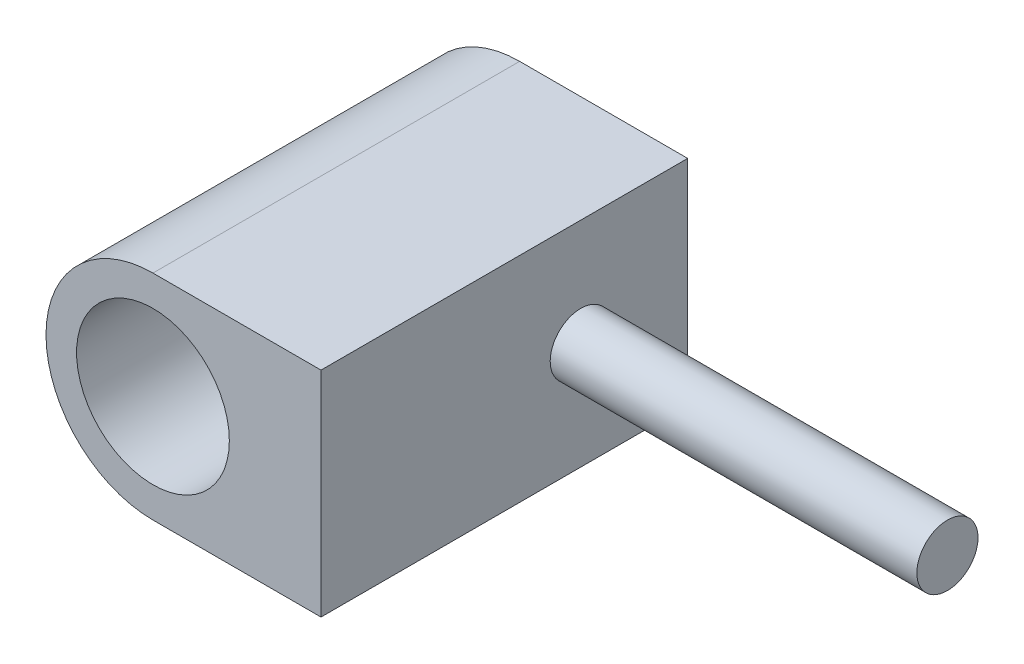
ISO-10303-21;
HEADER;
FILE_DESCRIPTION(('STEP AP214'),'2;1');
FILE_NAME('part.step','',(''),(''),'','','');
FILE_SCHEMA(('AUTOMOTIVE_DESIGN { 1 0 10303 214 1 1 1 1 }'));
ENDSEC;
DATA;
#1=APPLICATION_CONTEXT('core data for automotive mechanical design processes');
#2=APPLICATION_PROTOCOL_DEFINITION('international standard','automotive_design',2000,#1);
#3=PRODUCT_CONTEXT('',#1,'mechanical');
#4=PRODUCT('Part','Part','',(#3));
#5=PRODUCT_RELATED_PRODUCT_CATEGORY('part','',(#4));
#6=PRODUCT_DEFINITION_FORMATION('','',#4);
#7=PRODUCT_DEFINITION_CONTEXT('part definition',#1,'design');
#8=PRODUCT_DEFINITION('design','',#6,#7);
#9=PRODUCT_DEFINITION_SHAPE('','',#8);
#10=(LENGTH_UNIT() NAMED_UNIT(*) SI_UNIT(.MILLI.,.METRE.));
#11=(NAMED_UNIT(*) PLANE_ANGLE_UNIT() SI_UNIT($,.RADIAN.));
#12=(NAMED_UNIT(*) SI_UNIT($,.STERADIAN.) SOLID_ANGLE_UNIT());
#13=UNCERTAINTY_MEASURE_WITH_UNIT(LENGTH_MEASURE(1.E-05),#10,'distance_accuracy_value','');
#14=(GEOMETRIC_REPRESENTATION_CONTEXT(3) GLOBAL_UNCERTAINTY_ASSIGNED_CONTEXT((#13)) GLOBAL_UNIT_ASSIGNED_CONTEXT((#10,
#11,#12)) REPRESENTATION_CONTEXT('',''));
#15=CARTESIAN_POINT('',(0.,0.,0.));
#16=DIRECTION('',(0.,0.,1.));
#17=DIRECTION('',(1.,0.,0.));
#18=AXIS2_PLACEMENT_3D('',#15,#16,#17);
#19=CARTESIAN_POINT('',(-55.,35.,120.));
#20=DIRECTION('',(0.,0.,-1.));
#21=DIRECTION('',(-1.,0.,0.));
#22=AXIS2_PLACEMENT_3D('',#19,#20,#21);
#23=CYLINDRICAL_SURFACE('',#22,20.);
#24=CARTESIAN_POINT('',(-55.,35.,0.));
#25=DIRECTION('',(0.,0.,1.));
#26=DIRECTION('',(1.,0.,0.));
#27=AXIS2_PLACEMENT_3D('',#24,#25,#26);
#28=CIRCLE('',#27,20.);
#29=CARTESIAN_POINT('',(-35.,35.,0.));
#30=VERTEX_POINT('',#29);
#31=EDGE_CURVE('E103',#30,#30,#28,.T.);
#32=ORIENTED_EDGE('',*,*,#31,.F.);
#33=EDGE_LOOP('',(#32));
#34=FACE_BOUND('',#33,.T.);
#35=CARTESIAN_POINT('',(-55.,35.,9.99999999999999));
#36=DIRECTION('',(0.,0.,1.));
#37=DIRECTION('',(1.,0.,0.));
#38=AXIS2_PLACEMENT_3D('',#35,#36,#37);
#39=CIRCLE('',#38,20.);
#40=CARTESIAN_POINT('',(-35.,35.,9.99999999999999));
#41=VERTEX_POINT('',#40);
#42=EDGE_CURVE('E109',#41,#41,#39,.T.);
#43=ORIENTED_EDGE('',*,*,#42,.T.);
#44=EDGE_LOOP('',(#43));
#45=FACE_BOUND('',#44,.T.);
#46=ADVANCED_FACE('F33',(#34,#45),#23,.F.);
#47=CARTESIAN_POINT('',(-55.,35.,120.));
#48=DIRECTION('',(0.,0.,1.));
#49=DIRECTION('',(1.,0.,0.));
#50=AXIS2_PLACEMENT_3D('',#47,#48,#49);
#51=PLANE('',#50);
#52=CARTESIAN_POINT('',(-55.,35.,120.));
#53=DIRECTION('',(0.,0.,1.));
#54=DIRECTION('',(1.,0.,0.));
#55=AXIS2_PLACEMENT_3D('',#52,#53,#54);
#56=CIRCLE('',#55,25.);
#57=CARTESIAN_POINT('',(-30.,35.,120.));
#58=VERTEX_POINT('',#57);
#59=EDGE_CURVE('E117',#58,#58,#56,.T.);
#60=ORIENTED_EDGE('',*,*,#59,.F.);
#61=EDGE_LOOP('',(#60));
#62=FACE_BOUND('',#61,.T.);
#63=DIRECTION('',(0.,1.,0.));
#64=VECTOR('',#63,1.);
#65=CARTESIAN_POINT('',(0.,0.,120.));
#66=LINE('',#65,#64);
#67=CARTESIAN_POINT('',(0.,0.,120.));
#68=VERTEX_POINT('',#67);
#69=CARTESIAN_POINT('',(0.,70.,120.));
#70=VERTEX_POINT('',#69);
#71=EDGE_CURVE('E86',#68,#70,#66,.T.);
#72=ORIENTED_EDGE('',*,*,#71,.T.);
#73=DIRECTION('',(-1.,0.,0.));
#74=VECTOR('',#73,1.);
#75=CARTESIAN_POINT('',(0.,70.,120.));
#76=LINE('',#75,#74);
#77=CARTESIAN_POINT('',(-55.,70.,120.));
#78=VERTEX_POINT('',#77);
#79=EDGE_CURVE('E81',#70,#78,#76,.T.);
#80=ORIENTED_EDGE('',*,*,#79,.T.);
#81=CARTESIAN_POINT('',(-55.,35.,120.));
#82=DIRECTION('',(0.,0.,1.));
#83=DIRECTION('',(1.,0.,0.));
#84=AXIS2_PLACEMENT_3D('',#81,#82,#83);
#85=CIRCLE('',#84,35.);
#86=CARTESIAN_POINT('',(-55.,0.,120.));
#87=VERTEX_POINT('',#86);
#88=EDGE_CURVE('E84',#78,#87,#85,.T.);
#89=ORIENTED_EDGE('',*,*,#88,.T.);
#90=DIRECTION('',(1.,0.,0.));
#91=VECTOR('',#90,1.);
#92=CARTESIAN_POINT('',(0.,0.,120.));
#93=LINE('',#92,#91);
#94=EDGE_CURVE('E50',#87,#68,#93,.T.);
#95=ORIENTED_EDGE('',*,*,#94,.T.);
#96=EDGE_LOOP('',(#72,#80,#89,#95));
#97=FACE_BOUND('',#96,.T.);
#98=ADVANCED_FACE('F82',(#62,#97),#51,.T.);
#99=CARTESIAN_POINT('',(-55.,35.,0.));
#100=DIRECTION('',(0.,0.,1.));
#101=DIRECTION('',(1.,0.,0.));
#102=AXIS2_PLACEMENT_3D('',#99,#100,#101);
#103=PLANE('',#102);
#104=DIRECTION('',(0.,1.,0.));
#105=VECTOR('',#104,1.);
#106=CARTESIAN_POINT('',(0.,0.,0.));
#107=LINE('',#106,#105);
#108=CARTESIAN_POINT('',(0.,0.,0.));
#109=VERTEX_POINT('',#108);
#110=CARTESIAN_POINT('',(0.,70.,0.));
#111=VERTEX_POINT('',#110);
#112=EDGE_CURVE('E100',#109,#111,#107,.T.);
#113=ORIENTED_EDGE('',*,*,#112,.F.);
#114=DIRECTION('',(1.,0.,0.));
#115=VECTOR('',#114,1.);
#116=CARTESIAN_POINT('',(0.,0.,0.));
#117=LINE('',#116,#115);
#118=CARTESIAN_POINT('',(-55.,0.,0.));
#119=VERTEX_POINT('',#118);
#120=EDGE_CURVE('E73',#119,#109,#117,.T.);
#121=ORIENTED_EDGE('',*,*,#120,.F.);
#122=CARTESIAN_POINT('',(-55.,35.,0.));
#123=DIRECTION('',(0.,0.,1.));
#124=DIRECTION('',(1.,0.,0.));
#125=AXIS2_PLACEMENT_3D('',#122,#123,#124);
#126=CIRCLE('',#125,35.);
#127=CARTESIAN_POINT('',(-55.,70.,0.));
#128=VERTEX_POINT('',#127);
#129=EDGE_CURVE('E67',#128,#119,#126,.T.);
#130=ORIENTED_EDGE('',*,*,#129,.F.);
#131=DIRECTION('',(-1.,0.,0.));
#132=VECTOR('',#131,1.);
#133=CARTESIAN_POINT('',(0.,70.,0.));
#134=LINE('',#133,#132);
#135=EDGE_CURVE('E91',#111,#128,#134,.T.);
#136=ORIENTED_EDGE('',*,*,#135,.F.);
#137=EDGE_LOOP('',(#113,#121,#130,#136));
#138=FACE_BOUND('',#137,.T.);
#139=ORIENTED_EDGE('',*,*,#31,.T.);
#140=EDGE_LOOP('',(#139));
#141=FACE_BOUND('',#140,.T.);
#142=ADVANCED_FACE('F139',(#138,#141),#103,.F.);
#143=CARTESIAN_POINT('',(0.,0.,120.));
#144=DIRECTION('',(-1.,0.,0.));
#145=DIRECTION('',(0.,0.,1.));
#146=AXIS2_PLACEMENT_3D('',#143,#144,#145);
#147=PLANE('',#146);
#148=CARTESIAN_POINT('',(0.,35.,35.));
#149=DIRECTION('',(-1.,0.,0.));
#150=DIRECTION('',(0.,0.,1.));
#151=AXIS2_PLACEMENT_3D('',#148,#149,#150);
#152=CIRCLE('',#151,10.);
#153=CARTESIAN_POINT('',(0.,35.,45.));
#154=VERTEX_POINT('',#153);
#155=EDGE_CURVE('E11',#154,#154,#152,.F.);
#156=ORIENTED_EDGE('',*,*,#155,.F.);
#157=EDGE_LOOP('',(#156));
#158=FACE_BOUND('',#157,.T.);
#159=ORIENTED_EDGE('',*,*,#112,.T.);
#160=DIRECTION('',(0.,0.,-1.));
#161=VECTOR('',#160,1.);
#162=CARTESIAN_POINT('',(0.,70.,120.));
#163=LINE('',#162,#161);
#164=EDGE_CURVE('E42',#70,#111,#163,.T.);
#165=ORIENTED_EDGE('',*,*,#164,.F.);
#166=ORIENTED_EDGE('',*,*,#71,.F.);
#167=DIRECTION('',(0.,0.,-1.));
#168=VECTOR('',#167,1.);
#169=CARTESIAN_POINT('',(0.,0.,120.));
#170=LINE('',#169,#168);
#171=EDGE_CURVE('E96',#68,#109,#170,.T.);
#172=ORIENTED_EDGE('',*,*,#171,.T.);
#173=EDGE_LOOP('',(#159,#165,#166,#172));
#174=FACE_BOUND('',#173,.T.);
#175=ADVANCED_FACE('F35',(#158,#174),#147,.F.);
#176=CARTESIAN_POINT('',(0.,70.,120.));
#177=DIRECTION('',(0.,-1.,0.));
#178=DIRECTION('',(1.,0.,0.));
#179=AXIS2_PLACEMENT_3D('',#176,#177,#178);
#180=PLANE('',#179);
#181=ORIENTED_EDGE('',*,*,#135,.T.);
#182=DIRECTION('',(0.,0.,-1.));
#183=VECTOR('',#182,1.);
#184=CARTESIAN_POINT('',(-55.,70.,120.));
#185=LINE('',#184,#183);
#186=EDGE_CURVE('E89',#78,#128,#185,.T.);
#187=ORIENTED_EDGE('',*,*,#186,.F.);
#188=ORIENTED_EDGE('',*,*,#79,.F.);
#189=ORIENTED_EDGE('',*,*,#164,.T.);
#190=EDGE_LOOP('',(#181,#187,#188,#189));
#191=FACE_BOUND('',#190,.T.);
#192=ADVANCED_FACE('F90',(#191),#180,.F.);
#193=CARTESIAN_POINT('',(-55.,35.,120.));
#194=DIRECTION('',(0.,0.,-1.));
#195=DIRECTION('',(-1.,0.,0.));
#196=AXIS2_PLACEMENT_3D('',#193,#194,#195);
#197=CYLINDRICAL_SURFACE('',#196,35.);
#198=ORIENTED_EDGE('',*,*,#129,.T.);
#199=DIRECTION('',(0.,0.,-1.));
#200=VECTOR('',#199,1.);
#201=CARTESIAN_POINT('',(-55.,0.,120.));
#202=LINE('',#201,#200);
#203=EDGE_CURVE('E92',#87,#119,#202,.T.);
#204=ORIENTED_EDGE('',*,*,#203,.F.);
#205=ORIENTED_EDGE('',*,*,#88,.F.);
#206=ORIENTED_EDGE('',*,*,#186,.T.);
#207=EDGE_LOOP('',(#198,#204,#205,#206));
#208=FACE_BOUND('',#207,.T.);
#209=ADVANCED_FACE('F94',(#208),#197,.T.);
#210=CARTESIAN_POINT('',(0.,0.,120.));
#211=DIRECTION('',(0.,1.,0.));
#212=DIRECTION('',(-1.,0.,0.));
#213=AXIS2_PLACEMENT_3D('',#210,#211,#212);
#214=PLANE('',#213);
#215=ORIENTED_EDGE('',*,*,#120,.T.);
#216=ORIENTED_EDGE('',*,*,#171,.F.);
#217=ORIENTED_EDGE('',*,*,#94,.F.);
#218=ORIENTED_EDGE('',*,*,#203,.T.);
#219=EDGE_LOOP('',(#215,#216,#217,#218));
#220=FACE_BOUND('',#219,.T.);
#221=ADVANCED_FACE('F158',(#220),#214,.F.);
#222=CARTESIAN_POINT('',(-55.,35.,9.99999999999999));
#223=DIRECTION('',(0.,0.,1.));
#224=DIRECTION('',(1.,0.,0.));
#225=AXIS2_PLACEMENT_3D('',#222,#223,#224);
#226=CYLINDRICAL_SURFACE('',#225,25.);
#227=CARTESIAN_POINT('',(-55.,35.,9.99999999999999));
#228=DIRECTION('',(0.,0.,1.));
#229=DIRECTION('',(1.,0.,0.));
#230=AXIS2_PLACEMENT_3D('',#227,#228,#229);
#231=CIRCLE('',#230,25.);
#232=CARTESIAN_POINT('',(-30.,35.,9.99999999999999));
#233=VERTEX_POINT('',#232);
#234=EDGE_CURVE('E111',#233,#233,#231,.T.);
#235=ORIENTED_EDGE('',*,*,#234,.F.);
#236=EDGE_LOOP('',(#235));
#237=FACE_BOUND('',#236,.T.);
#238=ORIENTED_EDGE('',*,*,#59,.T.);
#239=EDGE_LOOP('',(#238));
#240=FACE_BOUND('',#239,.T.);
#241=ADVANCED_FACE('F155',(#237,#240),#226,.F.);
#242=CARTESIAN_POINT('',(-55.,35.,9.99999999999999));
#243=DIRECTION('',(0.,0.,1.));
#244=DIRECTION('',(1.,0.,0.));
#245=AXIS2_PLACEMENT_3D('',#242,#243,#244);
#246=PLANE('',#245);
#247=ORIENTED_EDGE('',*,*,#42,.F.);
#248=EDGE_LOOP('',(#247));
#249=FACE_BOUND('',#248,.T.);
#250=ORIENTED_EDGE('',*,*,#234,.T.);
#251=EDGE_LOOP('',(#250));
#252=FACE_BOUND('',#251,.T.);
#253=ADVANCED_FACE('F133',(#249,#252),#246,.T.);
#254=CARTESIAN_POINT('',(120.,35.,35.));
#255=DIRECTION('',(-1.,0.,0.));
#256=DIRECTION('',(0.,0.,1.));
#257=AXIS2_PLACEMENT_3D('',#254,#255,#256);
#258=CYLINDRICAL_SURFACE('',#257,10.);
#259=CARTESIAN_POINT('',(120.,35.,35.));
#260=DIRECTION('',(1.,0.,0.));
#261=DIRECTION('',(0.,0.,-1.));
#262=AXIS2_PLACEMENT_3D('',#259,#260,#261);
#263=CIRCLE('',#262,10.);
#264=CARTESIAN_POINT('',(120.,35.,25.));
#265=VERTEX_POINT('',#264);
#266=EDGE_CURVE('E122',#265,#265,#263,.T.);
#267=ORIENTED_EDGE('',*,*,#266,.F.);
#268=EDGE_LOOP('',(#267));
#269=FACE_BOUND('',#268,.T.);
#270=ORIENTED_EDGE('',*,*,#155,.T.);
#271=EDGE_LOOP('',(#270));
#272=FACE_BOUND('',#271,.T.);
#273=ADVANCED_FACE('F130',(#269,#272),#258,.T.);
#274=CARTESIAN_POINT('',(120.,35.,35.));
#275=DIRECTION('',(1.,0.,0.));
#276=DIRECTION('',(0.,0.,-1.));
#277=AXIS2_PLACEMENT_3D('',#274,#275,#276);
#278=PLANE('',#277);
#279=ORIENTED_EDGE('',*,*,#266,.T.);
#280=EDGE_LOOP('',(#279));
#281=FACE_BOUND('',#280,.T.);
#282=ADVANCED_FACE('F128',(#281),#278,.T.);
#283=CLOSED_SHELL('',(#46,#98,#142,#175,#192,#209,#221,#241,#253,#273,#282));
#284=MANIFOLD_SOLID_BREP('B2',#283);
#285=ADVANCED_BREP_SHAPE_REPRESENTATION('',(#18,#284),#14);
#286=SHAPE_DEFINITION_REPRESENTATION(#9,#285);
ENDSEC;
END-ISO-10303-21;
